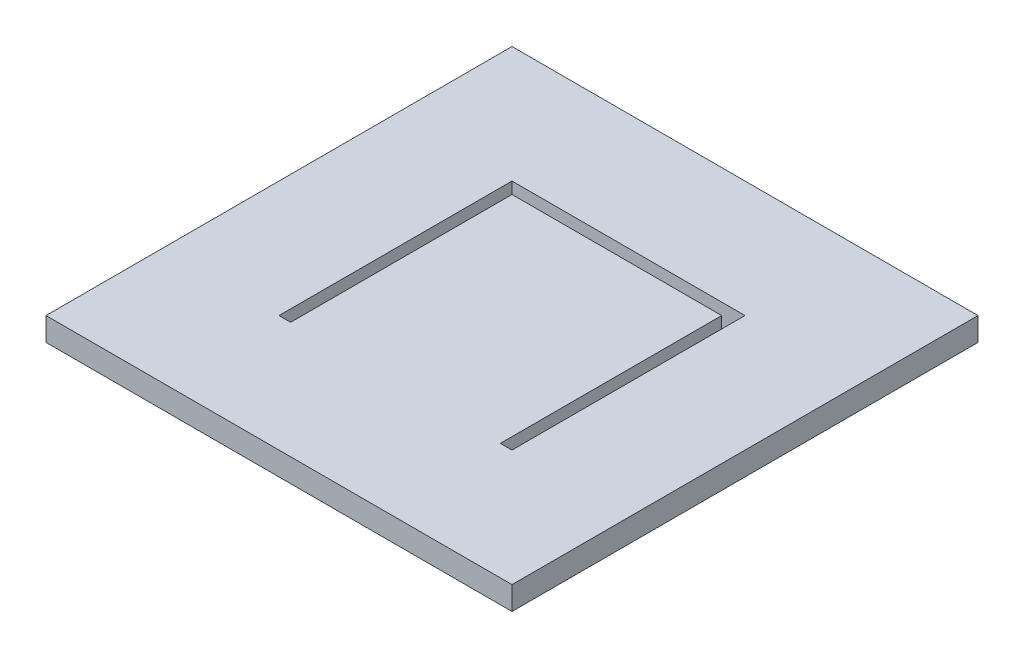
ISO-10303-21;
HEADER;
FILE_DESCRIPTION(('STEP AP214'),'2;1');
FILE_NAME('part.step','',(''),(''),'','','');
FILE_SCHEMA(('AUTOMOTIVE_DESIGN { 1 0 10303 214 1 1 1 1 }'));
ENDSEC;
DATA;
#1=APPLICATION_CONTEXT('core data for automotive mechanical design processes');
#2=APPLICATION_PROTOCOL_DEFINITION('international standard','automotive_design',2000,#1);
#3=PRODUCT_CONTEXT('',#1,'mechanical');
#4=PRODUCT('Part','Part','',(#3));
#5=PRODUCT_RELATED_PRODUCT_CATEGORY('part','',(#4));
#6=PRODUCT_DEFINITION_FORMATION('','',#4);
#7=PRODUCT_DEFINITION_CONTEXT('part definition',#1,'design');
#8=PRODUCT_DEFINITION('design','',#6,#7);
#9=PRODUCT_DEFINITION_SHAPE('','',#8);
#10=(LENGTH_UNIT() NAMED_UNIT(*) SI_UNIT(.MILLI.,.METRE.));
#11=(NAMED_UNIT(*) PLANE_ANGLE_UNIT() SI_UNIT($,.RADIAN.));
#12=(NAMED_UNIT(*) SI_UNIT($,.STERADIAN.) SOLID_ANGLE_UNIT());
#13=UNCERTAINTY_MEASURE_WITH_UNIT(LENGTH_MEASURE(1.E-05),#10,'distance_accuracy_value','');
#14=(GEOMETRIC_REPRESENTATION_CONTEXT(3) GLOBAL_UNCERTAINTY_ASSIGNED_CONTEXT((#13)) GLOBAL_UNIT_ASSIGNED_CONTEXT((#10,
#11,#12)) REPRESENTATION_CONTEXT('',''));
#15=CARTESIAN_POINT('',(0.,0.,0.));
#16=DIRECTION('',(0.,0.,1.));
#17=DIRECTION('',(1.,0.,0.));
#18=AXIS2_PLACEMENT_3D('',#15,#16,#17);
#19=CARTESIAN_POINT('',(0.,-10.,100.));
#20=DIRECTION('',(0.,0.,1.));
#21=DIRECTION('',(1.,0.,0.));
#22=AXIS2_PLACEMENT_3D('',#19,#20,#21);
#23=PLANE('',#22);
#24=DIRECTION('',(1.,0.,0.));
#25=VECTOR('',#24,1.);
#26=CARTESIAN_POINT('',(0.,0.,100.));
#27=LINE('',#26,#25);
#28=CARTESIAN_POINT('',(-100.,0.,100.));
#29=VERTEX_POINT('',#28);
#30=CARTESIAN_POINT('',(100.,0.,100.));
#31=VERTEX_POINT('',#30);
#32=EDGE_CURVE('E177',#29,#31,#27,.T.);
#33=ORIENTED_EDGE('',*,*,#32,.F.);
#34=DIRECTION('',(0.,1.,0.));
#35=VECTOR('',#34,1.);
#36=CARTESIAN_POINT('',(-100.,-10.,100.));
#37=LINE('',#36,#35);
#38=CARTESIAN_POINT('',(-100.,-10.,100.));
#39=VERTEX_POINT('',#38);
#40=EDGE_CURVE('E11',#39,#29,#37,.T.);
#41=ORIENTED_EDGE('',*,*,#40,.F.);
#42=DIRECTION('',(1.,0.,0.));
#43=VECTOR('',#42,1.);
#44=CARTESIAN_POINT('',(0.,-10.,100.));
#45=LINE('',#44,#43);
#46=CARTESIAN_POINT('',(100.,-10.,100.));
#47=VERTEX_POINT('',#46);
#48=EDGE_CURVE('E189',#39,#47,#45,.T.);
#49=ORIENTED_EDGE('',*,*,#48,.T.);
#50=DIRECTION('',(0.,1.,0.));
#51=VECTOR('',#50,1.);
#52=CARTESIAN_POINT('',(100.,-10.,100.));
#53=LINE('',#52,#51);
#54=EDGE_CURVE('E38',#47,#31,#53,.T.);
#55=ORIENTED_EDGE('',*,*,#54,.T.);
#56=EDGE_LOOP('',(#33,#41,#49,#55));
#57=FACE_BOUND('',#56,.T.);
#58=ADVANCED_FACE('F35',(#57),#23,.T.);
#59=CARTESIAN_POINT('',(-100.,-10.,0.));
#60=DIRECTION('',(1.,0.,0.));
#61=DIRECTION('',(0.,0.,-1.));
#62=AXIS2_PLACEMENT_3D('',#59,#60,#61);
#63=PLANE('',#62);
#64=DIRECTION('',(0.,0.,-1.));
#65=VECTOR('',#64,1.);
#66=CARTESIAN_POINT('',(-100.,0.,0.));
#67=LINE('',#66,#65);
#68=CARTESIAN_POINT('',(-100.,0.,-100.));
#69=VERTEX_POINT('',#68);
#70=EDGE_CURVE('E193',#29,#69,#67,.T.);
#71=ORIENTED_EDGE('',*,*,#70,.T.);
#72=DIRECTION('',(0.,1.,0.));
#73=VECTOR('',#72,1.);
#74=CARTESIAN_POINT('',(-100.,-10.,-100.));
#75=LINE('',#74,#73);
#76=CARTESIAN_POINT('',(-100.,-10.,-100.));
#77=VERTEX_POINT('',#76);
#78=EDGE_CURVE('E43',#77,#69,#75,.T.);
#79=ORIENTED_EDGE('',*,*,#78,.F.);
#80=DIRECTION('',(0.,0.,-1.));
#81=VECTOR('',#80,1.);
#82=CARTESIAN_POINT('',(-100.,-10.,0.));
#83=LINE('',#82,#81);
#84=EDGE_CURVE('E198',#39,#77,#83,.T.);
#85=ORIENTED_EDGE('',*,*,#84,.F.);
#86=ORIENTED_EDGE('',*,*,#40,.T.);
#87=EDGE_LOOP('',(#71,#79,#85,#86));
#88=FACE_BOUND('',#87,.T.);
#89=ADVANCED_FACE('F225',(#88),#63,.F.);
#90=CARTESIAN_POINT('',(0.,-10.,-100.));
#91=DIRECTION('',(0.,0.,1.));
#92=DIRECTION('',(1.,0.,0.));
#93=AXIS2_PLACEMENT_3D('',#90,#91,#92);
#94=PLANE('',#93);
#95=DIRECTION('',(1.,0.,0.));
#96=VECTOR('',#95,1.);
#97=CARTESIAN_POINT('',(0.,0.,-100.));
#98=LINE('',#97,#96);
#99=CARTESIAN_POINT('',(100.,0.,-100.));
#100=VERTEX_POINT('',#99);
#101=EDGE_CURVE('E205',#69,#100,#98,.T.);
#102=ORIENTED_EDGE('',*,*,#101,.T.);
#103=DIRECTION('',(0.,1.,0.));
#104=VECTOR('',#103,1.);
#105=CARTESIAN_POINT('',(100.,-10.,-100.));
#106=LINE('',#105,#104);
#107=CARTESIAN_POINT('',(100.,-10.,-100.));
#108=VERTEX_POINT('',#107);
#109=EDGE_CURVE('E210',#108,#100,#106,.T.);
#110=ORIENTED_EDGE('',*,*,#109,.F.);
#111=DIRECTION('',(1.,0.,0.));
#112=VECTOR('',#111,1.);
#113=CARTESIAN_POINT('',(0.,-10.,-100.));
#114=LINE('',#113,#112);
#115=EDGE_CURVE('E196',#77,#108,#114,.T.);
#116=ORIENTED_EDGE('',*,*,#115,.F.);
#117=ORIENTED_EDGE('',*,*,#78,.T.);
#118=EDGE_LOOP('',(#102,#110,#116,#117));
#119=FACE_BOUND('',#118,.T.);
#120=ADVANCED_FACE('F229',(#119),#94,.F.);
#121=CARTESIAN_POINT('',(100.,-10.,0.));
#122=DIRECTION('',(1.,0.,0.));
#123=DIRECTION('',(0.,0.,-1.));
#124=AXIS2_PLACEMENT_3D('',#121,#122,#123);
#125=PLANE('',#124);
#126=DIRECTION('',(0.,0.,-1.));
#127=VECTOR('',#126,1.);
#128=CARTESIAN_POINT('',(100.,0.,0.));
#129=LINE('',#128,#127);
#130=EDGE_CURVE('E202',#31,#100,#129,.T.);
#131=ORIENTED_EDGE('',*,*,#130,.F.);
#132=ORIENTED_EDGE('',*,*,#54,.F.);
#133=DIRECTION('',(0.,0.,-1.));
#134=VECTOR('',#133,1.);
#135=CARTESIAN_POINT('',(100.,-10.,0.));
#136=LINE('',#135,#134);
#137=EDGE_CURVE('E192',#47,#108,#136,.T.);
#138=ORIENTED_EDGE('',*,*,#137,.T.);
#139=ORIENTED_EDGE('',*,*,#109,.T.);
#140=EDGE_LOOP('',(#131,#132,#138,#139));
#141=FACE_BOUND('',#140,.T.);
#142=ADVANCED_FACE('F218',(#141),#125,.T.);
#143=CARTESIAN_POINT('',(0.,-10.,0.));
#144=DIRECTION('',(0.,1.,0.));
#145=DIRECTION('',(0.,0.,1.));
#146=AXIS2_PLACEMENT_3D('',#143,#144,#145);
#147=PLANE('',#146);
#148=DIRECTION('',(1.,0.,0.));
#149=VECTOR('',#148,1.);
#150=CARTESIAN_POINT('',(-50.,-10.,-45.));
#151=LINE('',#150,#149);
#152=CARTESIAN_POINT('',(-45.,-10.,-45.));
#153=VERTEX_POINT('',#152);
#154=CARTESIAN_POINT('',(45.,-10.,-45.0000000000001));
#155=VERTEX_POINT('',#154);
#156=EDGE_CURVE('E136',#153,#155,#151,.T.);
#157=ORIENTED_EDGE('',*,*,#156,.T.);
#158=DIRECTION('',(0.,0.,1.));
#159=VECTOR('',#158,1.);
#160=CARTESIAN_POINT('',(45.,-10.,-50.));
#161=LINE('',#160,#159);
#162=CARTESIAN_POINT('',(45.,-10.,50.));
#163=VERTEX_POINT('',#162);
#164=EDGE_CURVE('E131',#155,#163,#161,.T.);
#165=ORIENTED_EDGE('',*,*,#164,.T.);
#166=DIRECTION('',(-1.,0.,0.));
#167=VECTOR('',#166,1.);
#168=CARTESIAN_POINT('',(50.,-10.,50.));
#169=LINE('',#168,#167);
#170=CARTESIAN_POINT('',(50.,-10.,50.));
#171=VERTEX_POINT('',#170);
#172=EDGE_CURVE('E123',#171,#163,#169,.T.);
#173=ORIENTED_EDGE('',*,*,#172,.F.);
#174=DIRECTION('',(0.,0.,1.));
#175=VECTOR('',#174,1.);
#176=CARTESIAN_POINT('',(50.,-10.,-50.));
#177=LINE('',#176,#175);
#178=CARTESIAN_POINT('',(50.,-10.,-50.));
#179=VERTEX_POINT('',#178);
#180=EDGE_CURVE('E130',#179,#171,#177,.T.);
#181=ORIENTED_EDGE('',*,*,#180,.F.);
#182=DIRECTION('',(1.,0.,0.));
#183=VECTOR('',#182,1.);
#184=CARTESIAN_POINT('',(-50.,-10.,-50.));
#185=LINE('',#184,#183);
#186=CARTESIAN_POINT('',(-50.,-10.,-50.));
#187=VERTEX_POINT('',#186);
#188=EDGE_CURVE('E149',#187,#179,#185,.T.);
#189=ORIENTED_EDGE('',*,*,#188,.F.);
#190=DIRECTION('',(0.,0.,-1.));
#191=VECTOR('',#190,1.);
#192=CARTESIAN_POINT('',(-50.,-10.,49.9999999999999));
#193=LINE('',#192,#191);
#194=CARTESIAN_POINT('',(-50.,-10.,49.9999999999999));
#195=VERTEX_POINT('',#194);
#196=EDGE_CURVE('E151',#195,#187,#193,.T.);
#197=ORIENTED_EDGE('',*,*,#196,.F.);
#198=DIRECTION('',(-1.,0.,0.));
#199=VECTOR('',#198,1.);
#200=CARTESIAN_POINT('',(-45.,-10.,49.9999999999999));
#201=LINE('',#200,#199);
#202=CARTESIAN_POINT('',(-45.,-10.,49.9999999999999));
#203=VERTEX_POINT('',#202);
#204=EDGE_CURVE('E153',#203,#195,#201,.T.);
#205=ORIENTED_EDGE('',*,*,#204,.F.);
#206=DIRECTION('',(0.,0.,-1.));
#207=VECTOR('',#206,1.);
#208=CARTESIAN_POINT('',(-45.,-10.,49.9999999999999));
#209=LINE('',#208,#207);
#210=EDGE_CURVE('E155',#203,#153,#209,.T.);
#211=ORIENTED_EDGE('',*,*,#210,.T.);
#212=EDGE_LOOP('',(#157,#165,#173,#181,#189,#197,#205,#211));
#213=FACE_BOUND('',#212,.T.);
#214=ORIENTED_EDGE('',*,*,#48,.F.);
#215=ORIENTED_EDGE('',*,*,#84,.T.);
#216=ORIENTED_EDGE('',*,*,#115,.T.);
#217=ORIENTED_EDGE('',*,*,#137,.F.);
#218=EDGE_LOOP('',(#214,#215,#216,#217));
#219=FACE_BOUND('',#218,.T.);
#220=ADVANCED_FACE('F138',(#213,#219),#147,.F.);
#221=CARTESIAN_POINT('',(0.,0.,0.));
#222=DIRECTION('',(0.,1.,0.));
#223=DIRECTION('',(0.,0.,1.));
#224=AXIS2_PLACEMENT_3D('',#221,#222,#223);
#225=PLANE('',#224);
#226=DIRECTION('',(0.,0.,1.));
#227=VECTOR('',#226,1.);
#228=CARTESIAN_POINT('',(45.,0.,-50.));
#229=LINE('',#228,#227);
#230=CARTESIAN_POINT('',(45.,0.,-45.0000000000001));
#231=VERTEX_POINT('',#230);
#232=CARTESIAN_POINT('',(45.,0.,50.));
#233=VERTEX_POINT('',#232);
#234=EDGE_CURVE('E59',#231,#233,#229,.T.);
#235=ORIENTED_EDGE('',*,*,#234,.F.);
#236=DIRECTION('',(1.,0.,0.));
#237=VECTOR('',#236,1.);
#238=CARTESIAN_POINT('',(-50.,0.,-45.));
#239=LINE('',#238,#237);
#240=CARTESIAN_POINT('',(-45.,0.,-45.));
#241=VERTEX_POINT('',#240);
#242=EDGE_CURVE('E142',#241,#231,#239,.T.);
#243=ORIENTED_EDGE('',*,*,#242,.F.);
#244=DIRECTION('',(0.,0.,-1.));
#245=VECTOR('',#244,1.);
#246=CARTESIAN_POINT('',(-45.,0.,49.9999999999999));
#247=LINE('',#246,#245);
#248=CARTESIAN_POINT('',(-45.,0.,49.9999999999999));
#249=VERTEX_POINT('',#248);
#250=EDGE_CURVE('E145',#249,#241,#247,.T.);
#251=ORIENTED_EDGE('',*,*,#250,.F.);
#252=DIRECTION('',(-1.,0.,0.));
#253=VECTOR('',#252,1.);
#254=CARTESIAN_POINT('',(-45.,0.,49.9999999999999));
#255=LINE('',#254,#253);
#256=CARTESIAN_POINT('',(-50.,0.,49.9999999999999));
#257=VERTEX_POINT('',#256);
#258=EDGE_CURVE('E170',#249,#257,#255,.T.);
#259=ORIENTED_EDGE('',*,*,#258,.T.);
#260=DIRECTION('',(0.,0.,-1.));
#261=VECTOR('',#260,1.);
#262=CARTESIAN_POINT('',(-50.,0.,49.9999999999999));
#263=LINE('',#262,#261);
#264=CARTESIAN_POINT('',(-50.,0.,-50.));
#265=VERTEX_POINT('',#264);
#266=EDGE_CURVE('E167',#257,#265,#263,.T.);
#267=ORIENTED_EDGE('',*,*,#266,.T.);
#268=DIRECTION('',(1.,0.,0.));
#269=VECTOR('',#268,1.);
#270=CARTESIAN_POINT('',(-50.,0.,-50.));
#271=LINE('',#270,#269);
#272=CARTESIAN_POINT('',(50.,0.,-50.));
#273=VERTEX_POINT('',#272);
#274=EDGE_CURVE('E164',#265,#273,#271,.T.);
#275=ORIENTED_EDGE('',*,*,#274,.T.);
#276=DIRECTION('',(0.,0.,1.));
#277=VECTOR('',#276,1.);
#278=CARTESIAN_POINT('',(50.,0.,-50.));
#279=LINE('',#278,#277);
#280=CARTESIAN_POINT('',(50.,0.,50.));
#281=VERTEX_POINT('',#280);
#282=EDGE_CURVE('E161',#273,#281,#279,.T.);
#283=ORIENTED_EDGE('',*,*,#282,.T.);
#284=DIRECTION('',(-1.,0.,0.));
#285=VECTOR('',#284,1.);
#286=CARTESIAN_POINT('',(50.,0.,50.));
#287=LINE('',#286,#285);
#288=EDGE_CURVE('E159',#281,#233,#287,.T.);
#289=ORIENTED_EDGE('',*,*,#288,.T.);
#290=EDGE_LOOP('',(#235,#243,#251,#259,#267,#275,#283,#289));
#291=FACE_BOUND('',#290,.T.);
#292=ORIENTED_EDGE('',*,*,#32,.T.);
#293=ORIENTED_EDGE('',*,*,#130,.T.);
#294=ORIENTED_EDGE('',*,*,#101,.F.);
#295=ORIENTED_EDGE('',*,*,#70,.F.);
#296=EDGE_LOOP('',(#292,#293,#294,#295));
#297=FACE_BOUND('',#296,.T.);
#298=ADVANCED_FACE('F222',(#291,#297),#225,.T.);
#299=CARTESIAN_POINT('',(45.,-10.,-50.));
#300=DIRECTION('',(-1.,0.,0.));
#301=DIRECTION('',(0.,0.,1.));
#302=AXIS2_PLACEMENT_3D('',#299,#300,#301);
#303=PLANE('',#302);
#304=ORIENTED_EDGE('',*,*,#234,.T.);
#305=DIRECTION('',(0.,1.,0.));
#306=VECTOR('',#305,1.);
#307=CARTESIAN_POINT('',(45.,-10.,50.));
#308=LINE('',#307,#306);
#309=EDGE_CURVE('E125',#163,#233,#308,.T.);
#310=ORIENTED_EDGE('',*,*,#309,.F.);
#311=ORIENTED_EDGE('',*,*,#164,.F.);
#312=DIRECTION('',(0.,1.,0.));
#313=VECTOR('',#312,1.);
#314=CARTESIAN_POINT('',(45.,-10.,-45.0000000000001));
#315=LINE('',#314,#313);
#316=EDGE_CURVE('E175',#155,#231,#315,.T.);
#317=ORIENTED_EDGE('',*,*,#316,.T.);
#318=EDGE_LOOP('',(#304,#310,#311,#317));
#319=FACE_BOUND('',#318,.T.);
#320=ADVANCED_FACE('F134',(#319),#303,.F.);
#321=CARTESIAN_POINT('',(-50.,-10.,-45.));
#322=DIRECTION('',(0.,0.,1.));
#323=DIRECTION('',(1.,0.,0.));
#324=AXIS2_PLACEMENT_3D('',#321,#322,#323);
#325=PLANE('',#324);
#326=ORIENTED_EDGE('',*,*,#242,.T.);
#327=ORIENTED_EDGE('',*,*,#316,.F.);
#328=ORIENTED_EDGE('',*,*,#156,.F.);
#329=DIRECTION('',(0.,1.,0.));
#330=VECTOR('',#329,1.);
#331=CARTESIAN_POINT('',(-45.,-10.,-45.));
#332=LINE('',#331,#330);
#333=EDGE_CURVE('E178',#153,#241,#332,.T.);
#334=ORIENTED_EDGE('',*,*,#333,.T.);
#335=EDGE_LOOP('',(#326,#327,#328,#334));
#336=FACE_BOUND('',#335,.T.);
#337=ADVANCED_FACE('F273',(#336),#325,.F.);
#338=CARTESIAN_POINT('',(-45.,-10.,49.9999999999999));
#339=DIRECTION('',(1.,0.,0.));
#340=DIRECTION('',(0.,0.,-1.));
#341=AXIS2_PLACEMENT_3D('',#338,#339,#340);
#342=PLANE('',#341);
#343=ORIENTED_EDGE('',*,*,#250,.T.);
#344=ORIENTED_EDGE('',*,*,#333,.F.);
#345=ORIENTED_EDGE('',*,*,#210,.F.);
#346=DIRECTION('',(0.,1.,0.));
#347=VECTOR('',#346,1.);
#348=CARTESIAN_POINT('',(-45.,-10.,49.9999999999999));
#349=LINE('',#348,#347);
#350=EDGE_CURVE('E180',#203,#249,#349,.T.);
#351=ORIENTED_EDGE('',*,*,#350,.T.);
#352=EDGE_LOOP('',(#343,#344,#345,#351));
#353=FACE_BOUND('',#352,.T.);
#354=ADVANCED_FACE('F281',(#353),#342,.F.);
#355=CARTESIAN_POINT('',(-45.,-10.,49.9999999999999));
#356=DIRECTION('',(0.,0.,-1.));
#357=DIRECTION('',(-1.,0.,0.));
#358=AXIS2_PLACEMENT_3D('',#355,#356,#357);
#359=PLANE('',#358);
#360=ORIENTED_EDGE('',*,*,#258,.F.);
#361=ORIENTED_EDGE('',*,*,#350,.F.);
#362=ORIENTED_EDGE('',*,*,#204,.T.);
#363=DIRECTION('',(0.,1.,0.));
#364=VECTOR('',#363,1.);
#365=CARTESIAN_POINT('',(-50.,-10.,49.9999999999999));
#366=LINE('',#365,#364);
#367=EDGE_CURVE('E182',#195,#257,#366,.T.);
#368=ORIENTED_EDGE('',*,*,#367,.T.);
#369=EDGE_LOOP('',(#360,#361,#362,#368));
#370=FACE_BOUND('',#369,.T.);
#371=ADVANCED_FACE('F291',(#370),#359,.T.);
#372=CARTESIAN_POINT('',(-50.,-10.,49.9999999999999));
#373=DIRECTION('',(1.,0.,0.));
#374=DIRECTION('',(0.,0.,-1.));
#375=AXIS2_PLACEMENT_3D('',#372,#373,#374);
#376=PLANE('',#375);
#377=ORIENTED_EDGE('',*,*,#266,.F.);
#378=ORIENTED_EDGE('',*,*,#367,.F.);
#379=ORIENTED_EDGE('',*,*,#196,.T.);
#380=DIRECTION('',(0.,1.,0.));
#381=VECTOR('',#380,1.);
#382=CARTESIAN_POINT('',(-50.,-10.,-50.));
#383=LINE('',#382,#381);
#384=EDGE_CURVE('E184',#187,#265,#383,.T.);
#385=ORIENTED_EDGE('',*,*,#384,.T.);
#386=EDGE_LOOP('',(#377,#378,#379,#385));
#387=FACE_BOUND('',#386,.T.);
#388=ADVANCED_FACE('F301',(#387),#376,.T.);
#389=CARTESIAN_POINT('',(-50.,-10.,-50.));
#390=DIRECTION('',(0.,0.,1.));
#391=DIRECTION('',(1.,0.,0.));
#392=AXIS2_PLACEMENT_3D('',#389,#390,#391);
#393=PLANE('',#392);
#394=ORIENTED_EDGE('',*,*,#274,.F.);
#395=ORIENTED_EDGE('',*,*,#384,.F.);
#396=ORIENTED_EDGE('',*,*,#188,.T.);
#397=DIRECTION('',(0.,1.,0.));
#398=VECTOR('',#397,1.);
#399=CARTESIAN_POINT('',(50.,-10.,-50.));
#400=LINE('',#399,#398);
#401=EDGE_CURVE('E186',#179,#273,#400,.T.);
#402=ORIENTED_EDGE('',*,*,#401,.T.);
#403=EDGE_LOOP('',(#394,#395,#396,#402));
#404=FACE_BOUND('',#403,.T.);
#405=ADVANCED_FACE('F311',(#404),#393,.T.);
#406=CARTESIAN_POINT('',(50.,-10.,-50.));
#407=DIRECTION('',(-1.,0.,0.));
#408=DIRECTION('',(0.,0.,1.));
#409=AXIS2_PLACEMENT_3D('',#406,#407,#408);
#410=PLANE('',#409);
#411=ORIENTED_EDGE('',*,*,#282,.F.);
#412=ORIENTED_EDGE('',*,*,#401,.F.);
#413=ORIENTED_EDGE('',*,*,#180,.T.);
#414=DIRECTION('',(0.,1.,0.));
#415=VECTOR('',#414,1.);
#416=CARTESIAN_POINT('',(50.,-10.,50.));
#417=LINE('',#416,#415);
#418=EDGE_CURVE('E51',#171,#281,#417,.T.);
#419=ORIENTED_EDGE('',*,*,#418,.T.);
#420=EDGE_LOOP('',(#411,#412,#413,#419));
#421=FACE_BOUND('',#420,.T.);
#422=ADVANCED_FACE('F321',(#421),#410,.T.);
#423=CARTESIAN_POINT('',(50.,-10.,50.));
#424=DIRECTION('',(0.,0.,-1.));
#425=DIRECTION('',(-1.,0.,0.));
#426=AXIS2_PLACEMENT_3D('',#423,#424,#425);
#427=PLANE('',#426);
#428=ORIENTED_EDGE('',*,*,#288,.F.);
#429=ORIENTED_EDGE('',*,*,#418,.F.);
#430=ORIENTED_EDGE('',*,*,#172,.T.);
#431=ORIENTED_EDGE('',*,*,#309,.T.);
#432=EDGE_LOOP('',(#428,#429,#430,#431));
#433=FACE_BOUND('',#432,.T.);
#434=ADVANCED_FACE('F124',(#433),#427,.T.);
#435=CLOSED_SHELL('',(#58,#89,#120,#142,#220,#298,#320,#337,#354,#371,#388,#405,#422,#434));
#436=MANIFOLD_SOLID_BREP('B2',#435);
#437=ADVANCED_BREP_SHAPE_REPRESENTATION('',(#18,#436),#14);
#438=SHAPE_DEFINITION_REPRESENTATION(#9,#437);
ENDSEC;
END-ISO-10303-21;
